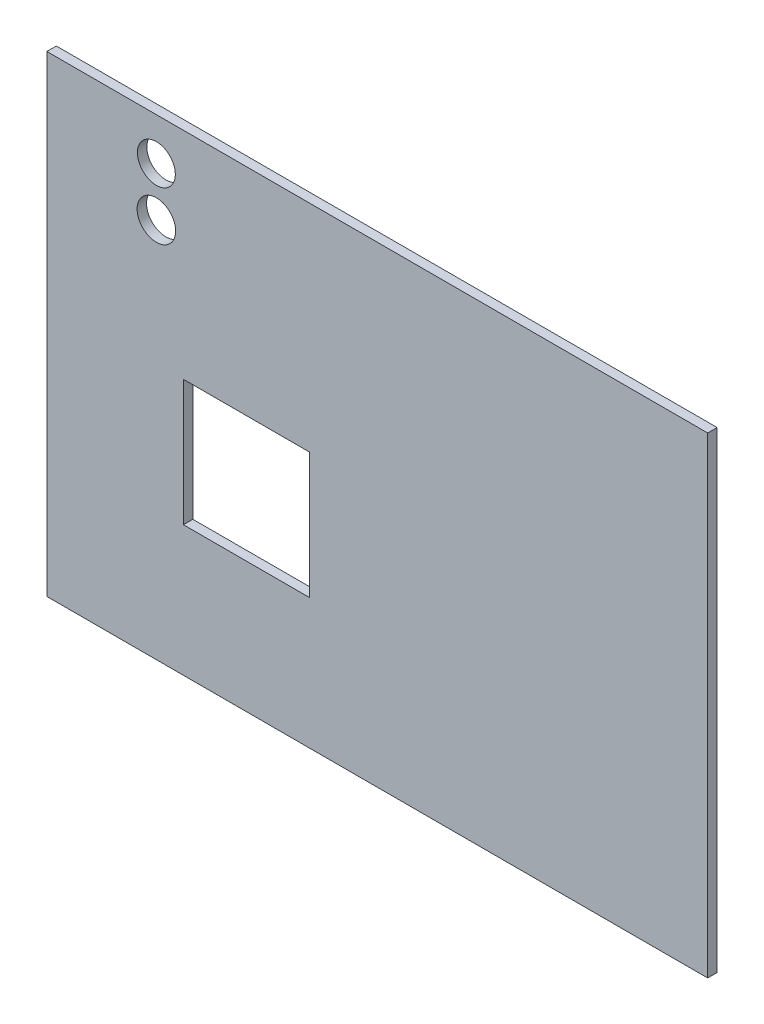
ISO-10303-21;
HEADER;
FILE_DESCRIPTION(('STEP AP214'),'2;1');
FILE_NAME('part.step','',(''),(''),'','','');
FILE_SCHEMA(('AUTOMOTIVE_DESIGN { 1 0 10303 214 1 1 1 1 }'));
ENDSEC;
DATA;
#1=APPLICATION_CONTEXT('core data for automotive mechanical design processes');
#2=APPLICATION_PROTOCOL_DEFINITION('international standard','automotive_design',2000,#1);
#3=PRODUCT_CONTEXT('',#1,'mechanical');
#4=PRODUCT('Part','Part','',(#3));
#5=PRODUCT_RELATED_PRODUCT_CATEGORY('part','',(#4));
#6=PRODUCT_DEFINITION_FORMATION('','',#4);
#7=PRODUCT_DEFINITION_CONTEXT('part definition',#1,'design');
#8=PRODUCT_DEFINITION('design','',#6,#7);
#9=PRODUCT_DEFINITION_SHAPE('','',#8);
#10=(LENGTH_UNIT() NAMED_UNIT(*) SI_UNIT(.MILLI.,.METRE.));
#11=(NAMED_UNIT(*) PLANE_ANGLE_UNIT() SI_UNIT($,.RADIAN.));
#12=(NAMED_UNIT(*) SI_UNIT($,.STERADIAN.) SOLID_ANGLE_UNIT());
#13=UNCERTAINTY_MEASURE_WITH_UNIT(LENGTH_MEASURE(1.E-05),#10,'distance_accuracy_value','');
#14=(GEOMETRIC_REPRESENTATION_CONTEXT(3) GLOBAL_UNCERTAINTY_ASSIGNED_CONTEXT((#13)) GLOBAL_UNIT_ASSIGNED_CONTEXT((#10,
#11,#12)) REPRESENTATION_CONTEXT('',''));
#15=CARTESIAN_POINT('',(0.,0.,0.));
#16=DIRECTION('',(0.,0.,1.));
#17=DIRECTION('',(1.,0.,0.));
#18=AXIS2_PLACEMENT_3D('',#15,#16,#17);
#19=CARTESIAN_POINT('',(0.,0.,-3.));
#20=DIRECTION('',(0.,0.,-1.));
#21=DIRECTION('',(-1.,0.,0.));
#22=AXIS2_PLACEMENT_3D('',#19,#20,#21);
#23=PLANE('',#22);
#24=CARTESIAN_POINT('',(-13.5020025712796,-45.0385186655839,-3.));
#25=DIRECTION('',(0.,0.,-1.));
#26=DIRECTION('',(-1.,0.,0.));
#27=AXIS2_PLACEMENT_3D('',#24,#25,#26);
#28=CIRCLE('',#27,6.12311552700056);
#29=CARTESIAN_POINT('',(-19.6251180982802,-45.0385186655839,-3.));
#30=VERTEX_POINT('',#29);
#31=EDGE_CURVE('E208',#30,#30,#28,.T.);
#32=ORIENTED_EDGE('',*,*,#31,.F.);
#33=EDGE_LOOP('',(#32));
#34=FACE_BOUND('',#33,.T.);
#35=CARTESIAN_POINT('',(-13.5020025712796,-29.4695954588793,-3.));
#36=DIRECTION('',(0.,0.,-1.));
#37=DIRECTION('',(-1.,0.,0.));
#38=AXIS2_PLACEMENT_3D('',#35,#36,#37);
#39=CIRCLE('',#38,6.02152849543776);
#40=CARTESIAN_POINT('',(-19.5235310667174,-29.4695954588793,-3.));
#41=VERTEX_POINT('',#40);
#42=EDGE_CURVE('E210',#41,#41,#39,.T.);
#43=ORIENTED_EDGE('',*,*,#42,.F.);
#44=EDGE_LOOP('',(#43));
#45=FACE_BOUND('',#44,.T.);
#46=DIRECTION('',(-1.,0.,0.));
#47=VECTOR('',#46,1.);
#48=CARTESIAN_POINT('',(161.698645521619,-166.038012074488,-3.));
#49=LINE('',#48,#47);
#50=CARTESIAN_POINT('',(161.698645521619,-166.038012074488,-3.));
#51=VERTEX_POINT('',#50);
#52=CARTESIAN_POINT('',(-48.3013544783814,-166.038012074488,-3.));
#53=VERTEX_POINT('',#52);
#54=EDGE_CURVE('E134',#51,#53,#49,.T.);
#55=ORIENTED_EDGE('',*,*,#54,.T.);
#56=DIRECTION('',(0.,1.,0.));
#57=VECTOR('',#56,1.);
#58=CARTESIAN_POINT('',(-48.3013544783814,-166.038012074488,-3.));
#59=LINE('',#58,#57);
#60=CARTESIAN_POINT('',(-48.3013544783814,-16.0380120744881,-3.));
#61=VERTEX_POINT('',#60);
#62=EDGE_CURVE('E137',#53,#61,#59,.T.);
#63=ORIENTED_EDGE('',*,*,#62,.T.);
#64=DIRECTION('',(1.,0.,0.));
#65=VECTOR('',#64,1.);
#66=CARTESIAN_POINT('',(-48.3013544783814,-16.0380120744881,-3.));
#67=LINE('',#66,#65);
#68=CARTESIAN_POINT('',(161.698645521619,-16.0380120744881,-3.));
#69=VERTEX_POINT('',#68);
#70=EDGE_CURVE('E140',#61,#69,#67,.T.);
#71=ORIENTED_EDGE('',*,*,#70,.T.);
#72=DIRECTION('',(0.,-1.,0.));
#73=VECTOR('',#72,1.);
#74=CARTESIAN_POINT('',(161.698645521619,-16.0380120744881,-3.));
#75=LINE('',#74,#73);
#76=EDGE_CURVE('E142',#69,#51,#75,.T.);
#77=ORIENTED_EDGE('',*,*,#76,.T.);
#78=EDGE_LOOP('',(#55,#63,#71,#77));
#79=FACE_BOUND('',#78,.T.);
#80=DIRECTION('',(1.,0.,0.));
#81=VECTOR('',#80,1.);
#82=CARTESIAN_POINT('',(0.,-124.598736124177,-3.));
#83=LINE('',#82,#81);
#84=CARTESIAN_POINT('',(-4.91603128271436,-124.598736124177,-3.));
#85=VERTEX_POINT('',#84);
#86=CARTESIAN_POINT('',(35.0839687172856,-124.598736124177,-3.));
#87=VERTEX_POINT('',#86);
#88=EDGE_CURVE('E127',#85,#87,#83,.T.);
#89=ORIENTED_EDGE('',*,*,#88,.T.);
#90=DIRECTION('',(0.,1.,0.));
#91=VECTOR('',#90,1.);
#92=CARTESIAN_POINT('',(35.0839687172856,0.,-3.));
#93=LINE('',#92,#91);
#94=CARTESIAN_POINT('',(35.0839687172856,-84.5650902967474,-3.));
#95=VERTEX_POINT('',#94);
#96=EDGE_CURVE('E130',#87,#95,#93,.T.);
#97=ORIENTED_EDGE('',*,*,#96,.T.);
#98=DIRECTION('',(-1.,0.,0.));
#99=VECTOR('',#98,1.);
#100=CARTESIAN_POINT('',(0.,-84.5650902967474,-3.));
#101=LINE('',#100,#99);
#102=CARTESIAN_POINT('',(-4.91603128271436,-84.5650902967474,-3.));
#103=VERTEX_POINT('',#102);
#104=EDGE_CURVE('E122',#95,#103,#101,.T.);
#105=ORIENTED_EDGE('',*,*,#104,.T.);
#106=DIRECTION('',(0.,-1.,0.));
#107=VECTOR('',#106,1.);
#108=CARTESIAN_POINT('',(-4.91603128271436,0.,-3.));
#109=LINE('',#108,#107);
#110=EDGE_CURVE('E103',#103,#85,#109,.T.);
#111=ORIENTED_EDGE('',*,*,#110,.T.);
#112=EDGE_LOOP('',(#89,#97,#105,#111));
#113=FACE_BOUND('',#112,.T.);
#114=ADVANCED_FACE('F32',(#34,#45,#79,#113),#23,.T.);
#115=CARTESIAN_POINT('',(0.,0.,0.));
#116=DIRECTION('',(0.,0.,-1.));
#117=DIRECTION('',(-1.,0.,0.));
#118=AXIS2_PLACEMENT_3D('',#115,#116,#117);
#119=PLANE('',#118);
#120=CARTESIAN_POINT('',(-13.5020025712796,-45.0385186655839,0.));
#121=DIRECTION('',(0.,0.,1.));
#122=DIRECTION('',(1.,0.,0.));
#123=AXIS2_PLACEMENT_3D('',#120,#121,#122);
#124=CIRCLE('',#123,6.12311552700056);
#125=CARTESIAN_POINT('',(-7.37888704427906,-45.0385186655839,0.));
#126=VERTEX_POINT('',#125);
#127=EDGE_CURVE('E215',#126,#126,#124,.T.);
#128=ORIENTED_EDGE('',*,*,#127,.F.);
#129=EDGE_LOOP('',(#128));
#130=FACE_BOUND('',#129,.T.);
#131=CARTESIAN_POINT('',(-13.5020025712796,-29.4695954588793,0.));
#132=DIRECTION('',(0.,0.,1.));
#133=DIRECTION('',(1.,0.,0.));
#134=AXIS2_PLACEMENT_3D('',#131,#132,#133);
#135=CIRCLE('',#134,6.02152849543776);
#136=CARTESIAN_POINT('',(-7.48047407584186,-29.4695954588793,0.));
#137=VERTEX_POINT('',#136);
#138=EDGE_CURVE('E216',#137,#137,#135,.T.);
#139=ORIENTED_EDGE('',*,*,#138,.F.);
#140=EDGE_LOOP('',(#139));
#141=FACE_BOUND('',#140,.T.);
#142=DIRECTION('',(-1.,0.,0.));
#143=VECTOR('',#142,1.);
#144=CARTESIAN_POINT('',(161.698645521619,-166.038012074488,0.));
#145=LINE('',#144,#143);
#146=CARTESIAN_POINT('',(161.698645521619,-166.038012074488,0.));
#147=VERTEX_POINT('',#146);
#148=CARTESIAN_POINT('',(-48.3013544783814,-166.038012074488,0.));
#149=VERTEX_POINT('',#148);
#150=EDGE_CURVE('E133',#147,#149,#145,.T.);
#151=ORIENTED_EDGE('',*,*,#150,.F.);
#152=DIRECTION('',(0.,-1.,0.));
#153=VECTOR('',#152,1.);
#154=CARTESIAN_POINT('',(161.698645521619,-16.0380120744881,0.));
#155=LINE('',#154,#153);
#156=CARTESIAN_POINT('',(161.698645521619,-16.0380120744881,0.));
#157=VERTEX_POINT('',#156);
#158=EDGE_CURVE('E138',#157,#147,#155,.T.);
#159=ORIENTED_EDGE('',*,*,#158,.F.);
#160=DIRECTION('',(1.,0.,0.));
#161=VECTOR('',#160,1.);
#162=CARTESIAN_POINT('',(-48.3013544783814,-16.0380120744881,0.));
#163=LINE('',#162,#161);
#164=CARTESIAN_POINT('',(-48.3013544783814,-16.0380120744881,0.));
#165=VERTEX_POINT('',#164);
#166=EDGE_CURVE('E149',#165,#157,#163,.T.);
#167=ORIENTED_EDGE('',*,*,#166,.F.);
#168=DIRECTION('',(0.,1.,0.));
#169=VECTOR('',#168,1.);
#170=CARTESIAN_POINT('',(-48.3013544783814,-166.038012074488,0.));
#171=LINE('',#170,#169);
#172=EDGE_CURVE('E147',#149,#165,#171,.T.);
#173=ORIENTED_EDGE('',*,*,#172,.F.);
#174=EDGE_LOOP('',(#151,#159,#167,#173));
#175=FACE_BOUND('',#174,.T.);
#176=DIRECTION('',(0.,-1.,0.));
#177=VECTOR('',#176,1.);
#178=CARTESIAN_POINT('',(35.0839687172856,0.,0.));
#179=LINE('',#178,#177);
#180=CARTESIAN_POINT('',(35.0839687172856,-84.5650902967474,0.));
#181=VERTEX_POINT('',#180);
#182=CARTESIAN_POINT('',(35.0839687172856,-124.598736124177,0.));
#183=VERTEX_POINT('',#182);
#184=EDGE_CURVE('E55',#181,#183,#179,.T.);
#185=ORIENTED_EDGE('',*,*,#184,.T.);
#186=DIRECTION('',(-1.,0.,0.));
#187=VECTOR('',#186,1.);
#188=CARTESIAN_POINT('',(0.,-124.598736124177,0.));
#189=LINE('',#188,#187);
#190=CARTESIAN_POINT('',(-4.91603128271436,-124.598736124177,0.));
#191=VERTEX_POINT('',#190);
#192=EDGE_CURVE('E115',#183,#191,#189,.T.);
#193=ORIENTED_EDGE('',*,*,#192,.T.);
#194=DIRECTION('',(0.,1.,0.));
#195=VECTOR('',#194,1.);
#196=CARTESIAN_POINT('',(-4.91603128271436,0.,0.));
#197=LINE('',#196,#195);
#198=CARTESIAN_POINT('',(-4.91603128271436,-84.5650902967474,0.));
#199=VERTEX_POINT('',#198);
#200=EDGE_CURVE('E100',#191,#199,#197,.T.);
#201=ORIENTED_EDGE('',*,*,#200,.T.);
#202=DIRECTION('',(1.,0.,0.));
#203=VECTOR('',#202,1.);
#204=CARTESIAN_POINT('',(0.,-84.5650902967474,0.));
#205=LINE('',#204,#203);
#206=EDGE_CURVE('E109',#199,#181,#205,.T.);
#207=ORIENTED_EDGE('',*,*,#206,.T.);
#208=EDGE_LOOP('',(#185,#193,#201,#207));
#209=FACE_BOUND('',#208,.T.);
#210=ADVANCED_FACE('F113',(#130,#141,#175,#209),#119,.F.);
#211=CARTESIAN_POINT('',(161.698645521619,-166.038012074488,-3.));
#212=DIRECTION('',(0.,1.,0.));
#213=DIRECTION('',(-1.,0.,0.));
#214=AXIS2_PLACEMENT_3D('',#211,#212,#213);
#215=PLANE('',#214);
#216=ORIENTED_EDGE('',*,*,#150,.T.);
#217=DIRECTION('',(0.,0.,1.));
#218=VECTOR('',#217,1.);
#219=CARTESIAN_POINT('',(-48.3013544783814,-166.038012074488,-3.));
#220=LINE('',#219,#218);
#221=EDGE_CURVE('E11',#53,#149,#220,.T.);
#222=ORIENTED_EDGE('',*,*,#221,.F.);
#223=ORIENTED_EDGE('',*,*,#54,.F.);
#224=DIRECTION('',(0.,0.,1.));
#225=VECTOR('',#224,1.);
#226=CARTESIAN_POINT('',(161.698645521619,-166.038012074488,-3.));
#227=LINE('',#226,#225);
#228=EDGE_CURVE('E144',#51,#147,#227,.T.);
#229=ORIENTED_EDGE('',*,*,#228,.T.);
#230=EDGE_LOOP('',(#216,#222,#223,#229));
#231=FACE_BOUND('',#230,.T.);
#232=ADVANCED_FACE('F34',(#231),#215,.F.);
#233=CARTESIAN_POINT('',(-48.3013544783814,-166.038012074488,-3.));
#234=DIRECTION('',(1.,0.,0.));
#235=DIRECTION('',(0.,0.,-1.));
#236=AXIS2_PLACEMENT_3D('',#233,#234,#235);
#237=PLANE('',#236);
#238=ORIENTED_EDGE('',*,*,#172,.T.);
#239=DIRECTION('',(0.,0.,1.));
#240=VECTOR('',#239,1.);
#241=CARTESIAN_POINT('',(-48.3013544783814,-16.0380120744881,-3.));
#242=LINE('',#241,#240);
#243=EDGE_CURVE('E40',#61,#165,#242,.T.);
#244=ORIENTED_EDGE('',*,*,#243,.F.);
#245=ORIENTED_EDGE('',*,*,#62,.F.);
#246=ORIENTED_EDGE('',*,*,#221,.T.);
#247=EDGE_LOOP('',(#238,#244,#245,#246));
#248=FACE_BOUND('',#247,.T.);
#249=ADVANCED_FACE('F176',(#248),#237,.F.);
#250=CARTESIAN_POINT('',(-48.3013544783814,-16.0380120744881,-3.));
#251=DIRECTION('',(0.,-1.,0.));
#252=DIRECTION('',(0.,0.,-1.));
#253=AXIS2_PLACEMENT_3D('',#250,#251,#252);
#254=PLANE('',#253);
#255=ORIENTED_EDGE('',*,*,#166,.T.);
#256=DIRECTION('',(0.,0.,1.));
#257=VECTOR('',#256,1.);
#258=CARTESIAN_POINT('',(161.698645521619,-16.0380120744881,-3.));
#259=LINE('',#258,#257);
#260=EDGE_CURVE('E154',#69,#157,#259,.T.);
#261=ORIENTED_EDGE('',*,*,#260,.F.);
#262=ORIENTED_EDGE('',*,*,#70,.F.);
#263=ORIENTED_EDGE('',*,*,#243,.T.);
#264=EDGE_LOOP('',(#255,#261,#262,#263));
#265=FACE_BOUND('',#264,.T.);
#266=ADVANCED_FACE('F161',(#265),#254,.F.);
#267=CARTESIAN_POINT('',(161.698645521619,-16.0380120744881,-3.));
#268=DIRECTION('',(-1.,0.,0.));
#269=DIRECTION('',(0.,0.,1.));
#270=AXIS2_PLACEMENT_3D('',#267,#268,#269);
#271=PLANE('',#270);
#272=ORIENTED_EDGE('',*,*,#158,.T.);
#273=ORIENTED_EDGE('',*,*,#228,.F.);
#274=ORIENTED_EDGE('',*,*,#76,.F.);
#275=ORIENTED_EDGE('',*,*,#260,.T.);
#276=EDGE_LOOP('',(#272,#273,#274,#275));
#277=FACE_BOUND('',#276,.T.);
#278=ADVANCED_FACE('F169',(#277),#271,.F.);
#279=CARTESIAN_POINT('',(35.0839687172856,0.,-10.));
#280=DIRECTION('',(-1.,0.,0.));
#281=DIRECTION('',(0.,0.,1.));
#282=AXIS2_PLACEMENT_3D('',#279,#280,#281);
#283=PLANE('',#282);
#284=DIRECTION('',(0.,0.,1.));
#285=VECTOR('',#284,1.);
#286=CARTESIAN_POINT('',(35.0839687172856,-124.598736124177,-10.));
#287=LINE('',#286,#285);
#288=EDGE_CURVE('E120',#87,#183,#287,.T.);
#289=ORIENTED_EDGE('',*,*,#288,.T.);
#290=ORIENTED_EDGE('',*,*,#184,.F.);
#291=DIRECTION('',(0.,0.,1.));
#292=VECTOR('',#291,1.);
#293=CARTESIAN_POINT('',(35.0839687172856,-84.5650902967474,-10.));
#294=LINE('',#293,#292);
#295=EDGE_CURVE('E106',#95,#181,#294,.T.);
#296=ORIENTED_EDGE('',*,*,#295,.F.);
#297=ORIENTED_EDGE('',*,*,#96,.F.);
#298=EDGE_LOOP('',(#289,#290,#296,#297));
#299=FACE_BOUND('',#298,.T.);
#300=ADVANCED_FACE('F194',(#299),#283,.T.);
#301=CARTESIAN_POINT('',(0.,-124.598736124177,-10.));
#302=DIRECTION('',(0.,1.,0.));
#303=DIRECTION('',(-1.,0.,0.));
#304=AXIS2_PLACEMENT_3D('',#301,#302,#303);
#305=PLANE('',#304);
#306=DIRECTION('',(0.,0.,1.));
#307=VECTOR('',#306,1.);
#308=CARTESIAN_POINT('',(-4.91603128271436,-124.598736124177,-10.));
#309=LINE('',#308,#307);
#310=EDGE_CURVE('E105',#85,#191,#309,.T.);
#311=ORIENTED_EDGE('',*,*,#310,.T.);
#312=ORIENTED_EDGE('',*,*,#192,.F.);
#313=ORIENTED_EDGE('',*,*,#288,.F.);
#314=ORIENTED_EDGE('',*,*,#88,.F.);
#315=EDGE_LOOP('',(#311,#312,#313,#314));
#316=FACE_BOUND('',#315,.T.);
#317=ADVANCED_FACE('F201',(#316),#305,.T.);
#318=CARTESIAN_POINT('',(-4.91603128271436,0.,-10.));
#319=DIRECTION('',(1.,0.,0.));
#320=DIRECTION('',(0.,0.,-1.));
#321=AXIS2_PLACEMENT_3D('',#318,#319,#320);
#322=PLANE('',#321);
#323=DIRECTION('',(0.,0.,1.));
#324=VECTOR('',#323,1.);
#325=CARTESIAN_POINT('',(-4.91603128271436,-84.5650902967474,-10.));
#326=LINE('',#325,#324);
#327=EDGE_CURVE('E47',#103,#199,#326,.T.);
#328=ORIENTED_EDGE('',*,*,#327,.T.);
#329=ORIENTED_EDGE('',*,*,#200,.F.);
#330=ORIENTED_EDGE('',*,*,#310,.F.);
#331=ORIENTED_EDGE('',*,*,#110,.F.);
#332=EDGE_LOOP('',(#328,#329,#330,#331));
#333=FACE_BOUND('',#332,.T.);
#334=ADVANCED_FACE('F97',(#333),#322,.T.);
#335=CARTESIAN_POINT('',(0.,-84.5650902967474,-10.));
#336=DIRECTION('',(0.,-1.,0.));
#337=DIRECTION('',(0.,0.,-1.));
#338=AXIS2_PLACEMENT_3D('',#335,#336,#337);
#339=PLANE('',#338);
#340=ORIENTED_EDGE('',*,*,#295,.T.);
#341=ORIENTED_EDGE('',*,*,#206,.F.);
#342=ORIENTED_EDGE('',*,*,#327,.F.);
#343=ORIENTED_EDGE('',*,*,#104,.F.);
#344=EDGE_LOOP('',(#340,#341,#342,#343));
#345=FACE_BOUND('',#344,.T.);
#346=ADVANCED_FACE('F110',(#345),#339,.T.);
#347=CARTESIAN_POINT('',(-13.5020025712796,-29.4695954588793,-10.));
#348=DIRECTION('',(0.,0.,1.));
#349=DIRECTION('',(1.,0.,0.));
#350=AXIS2_PLACEMENT_3D('',#347,#348,#349);
#351=CYLINDRICAL_SURFACE('',#350,6.02152849543776);
#352=ORIENTED_EDGE('',*,*,#42,.T.);
#353=EDGE_LOOP('',(#352));
#354=FACE_BOUND('',#353,.T.);
#355=ORIENTED_EDGE('',*,*,#138,.T.);
#356=EDGE_LOOP('',(#355));
#357=FACE_BOUND('',#356,.T.);
#358=ADVANCED_FACE('F226',(#354,#357),#351,.F.);
#359=CARTESIAN_POINT('',(-13.5020025712796,-45.0385186655839,-10.));
#360=DIRECTION('',(0.,0.,1.));
#361=DIRECTION('',(1.,0.,0.));
#362=AXIS2_PLACEMENT_3D('',#359,#360,#361);
#363=CYLINDRICAL_SURFACE('',#362,6.12311552700056);
#364=ORIENTED_EDGE('',*,*,#31,.T.);
#365=EDGE_LOOP('',(#364));
#366=FACE_BOUND('',#365,.T.);
#367=ORIENTED_EDGE('',*,*,#127,.T.);
#368=EDGE_LOOP('',(#367));
#369=FACE_BOUND('',#368,.T.);
#370=ADVANCED_FACE('F222',(#366,#369),#363,.F.);
#371=CLOSED_SHELL('',(#114,#210,#232,#249,#266,#278,#300,#317,#334,#346,#358,#370));
#372=MANIFOLD_SOLID_BREP('B2',#371);
#373=ADVANCED_BREP_SHAPE_REPRESENTATION('',(#18,#372),#14);
#374=SHAPE_DEFINITION_REPRESENTATION(#9,#373);
ENDSEC;
END-ISO-10303-21;
